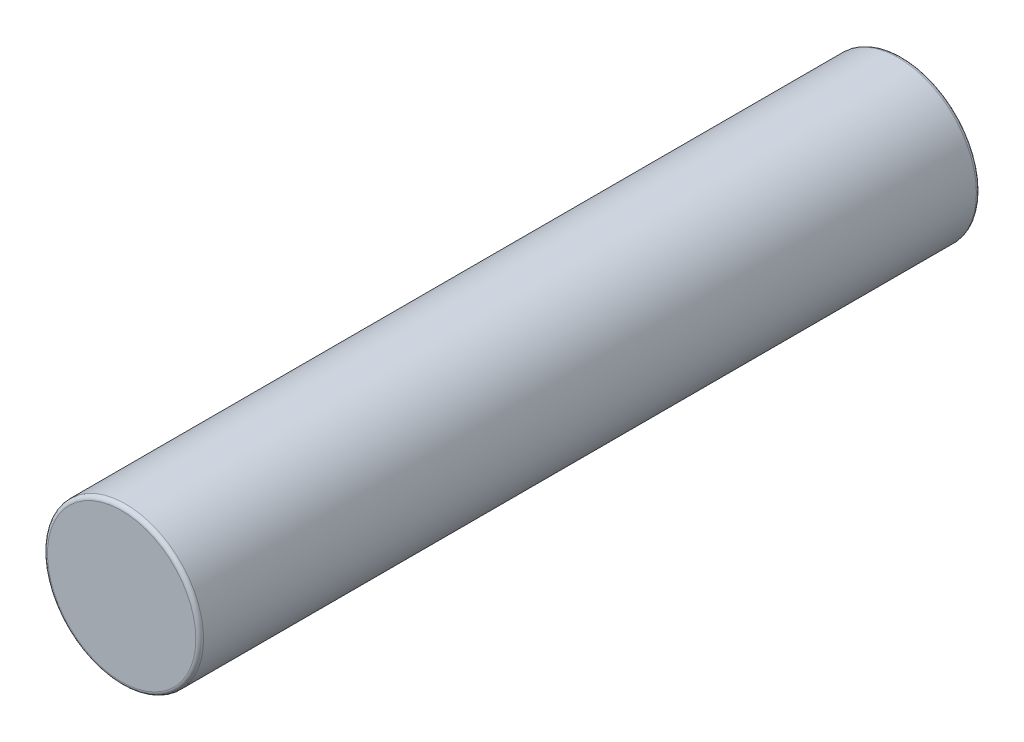
ISO-10303-21;
HEADER;
FILE_DESCRIPTION(('STEP AP214'),'2;1');
FILE_NAME('part.step','',(''),(''),'','','');
FILE_SCHEMA(('AUTOMOTIVE_DESIGN { 1 0 10303 214 1 1 1 1 }'));
ENDSEC;
DATA;
#1=APPLICATION_CONTEXT('core data for automotive mechanical design processes');
#2=APPLICATION_PROTOCOL_DEFINITION('international standard','automotive_design',2000,#1);
#3=PRODUCT_CONTEXT('',#1,'mechanical');
#4=PRODUCT('Part','Part','',(#3));
#5=PRODUCT_RELATED_PRODUCT_CATEGORY('part','',(#4));
#6=PRODUCT_DEFINITION_FORMATION('','',#4);
#7=PRODUCT_DEFINITION_CONTEXT('part definition',#1,'design');
#8=PRODUCT_DEFINITION('design','',#6,#7);
#9=PRODUCT_DEFINITION_SHAPE('','',#8);
#10=(LENGTH_UNIT() NAMED_UNIT(*) SI_UNIT(.MILLI.,.METRE.));
#11=(NAMED_UNIT(*) PLANE_ANGLE_UNIT() SI_UNIT($,.RADIAN.));
#12=(NAMED_UNIT(*) SI_UNIT($,.STERADIAN.) SOLID_ANGLE_UNIT());
#13=UNCERTAINTY_MEASURE_WITH_UNIT(LENGTH_MEASURE(1.E-05),#10,'distance_accuracy_value','');
#14=(GEOMETRIC_REPRESENTATION_CONTEXT(3) GLOBAL_UNCERTAINTY_ASSIGNED_CONTEXT((#13)) GLOBAL_UNIT_ASSIGNED_CONTEXT((#10,
#11,#12)) REPRESENTATION_CONTEXT('',''));
#15=CARTESIAN_POINT('',(0.,0.,0.));
#16=DIRECTION('',(0.,0.,1.));
#17=DIRECTION('',(1.,0.,0.));
#18=AXIS2_PLACEMENT_3D('',#15,#16,#17);
#19=CARTESIAN_POINT('',(0.,0.,200.));
#20=DIRECTION('',(0.,0.,-1.));
#21=DIRECTION('',(-1.,0.,0.));
#22=AXIS2_PLACEMENT_3D('',#19,#20,#21);
#23=CYLINDRICAL_SURFACE('',#22,20.);
#24=CARTESIAN_POINT('',(0.,0.,1.));
#25=DIRECTION('',(0.,0.,1.));
#26=DIRECTION('',(1.,0.,0.));
#27=AXIS2_PLACEMENT_3D('',#24,#25,#26);
#28=CIRCLE('',#27,20.);
#29=CARTESIAN_POINT('',(20.,0.,1.));
#30=VERTEX_POINT('',#29);
#31=EDGE_CURVE('E50',#30,#30,#28,.T.);
#32=ORIENTED_EDGE('',*,*,#31,.T.);
#33=EDGE_LOOP('',(#32));
#34=FACE_BOUND('',#33,.T.);
#35=CARTESIAN_POINT('',(0.,0.,199.));
#36=DIRECTION('',(0.,0.,1.));
#37=DIRECTION('',(1.,0.,0.));
#38=AXIS2_PLACEMENT_3D('',#35,#36,#37);
#39=CIRCLE('',#38,20.);
#40=CARTESIAN_POINT('',(20.,0.,199.));
#41=VERTEX_POINT('',#40);
#42=EDGE_CURVE('E55',#41,#41,#39,.F.);
#43=ORIENTED_EDGE('',*,*,#42,.T.);
#44=EDGE_LOOP('',(#43));
#45=FACE_BOUND('',#44,.T.);
#46=ADVANCED_FACE('F37',(#34,#45),#23,.T.);
#47=CARTESIAN_POINT('',(0.,0.,200.));
#48=DIRECTION('',(0.,0.,1.));
#49=DIRECTION('',(1.,0.,0.));
#50=AXIS2_PLACEMENT_3D('',#47,#48,#49);
#51=PLANE('',#50);
#52=CARTESIAN_POINT('',(0.,0.,200.));
#53=DIRECTION('',(0.,0.,1.));
#54=DIRECTION('',(1.,0.,0.));
#55=AXIS2_PLACEMENT_3D('',#52,#53,#54);
#56=CIRCLE('',#55,19.);
#57=CARTESIAN_POINT('',(19.,0.,200.));
#58=VERTEX_POINT('',#57);
#59=EDGE_CURVE('E10',#58,#58,#56,.T.);
#60=ORIENTED_EDGE('',*,*,#59,.T.);
#61=EDGE_LOOP('',(#60));
#62=FACE_BOUND('',#61,.T.);
#63=ADVANCED_FACE('F72',(#62),#51,.T.);
#64=CARTESIAN_POINT('',(0.,0.,0.));
#65=DIRECTION('',(0.,0.,1.));
#66=DIRECTION('',(1.,0.,0.));
#67=AXIS2_PLACEMENT_3D('',#64,#65,#66);
#68=PLANE('',#67);
#69=CARTESIAN_POINT('',(0.,0.,0.));
#70=DIRECTION('',(0.,0.,1.));
#71=DIRECTION('',(1.,0.,0.));
#72=AXIS2_PLACEMENT_3D('',#69,#70,#71);
#73=CIRCLE('',#72,19.);
#74=CARTESIAN_POINT('',(19.,0.,0.));
#75=VERTEX_POINT('',#74);
#76=EDGE_CURVE('E45',#75,#75,#73,.F.);
#77=ORIENTED_EDGE('',*,*,#76,.T.);
#78=EDGE_LOOP('',(#77));
#79=FACE_BOUND('',#78,.T.);
#80=ADVANCED_FACE('F69',(#79),#68,.F.);
#81=CARTESIAN_POINT('',(0.,0.,1.));
#82=DIRECTION('',(0.,0.,1.));
#83=DIRECTION('',(1.,0.,0.));
#84=AXIS2_PLACEMENT_3D('',#81,#82,#83);
#85=TOROIDAL_SURFACE('',#84,19.,1.);
#86=ORIENTED_EDGE('',*,*,#76,.F.);
#87=EDGE_LOOP('',(#86));
#88=FACE_BOUND('',#87,.T.);
#89=ORIENTED_EDGE('',*,*,#31,.F.);
#90=EDGE_LOOP('',(#89));
#91=FACE_BOUND('',#90,.T.);
#92=ADVANCED_FACE('F65',(#88,#91),#85,.T.);
#93=CARTESIAN_POINT('',(0.,0.,199.));
#94=DIRECTION('',(0.,0.,1.));
#95=DIRECTION('',(1.,0.,0.));
#96=AXIS2_PLACEMENT_3D('',#93,#94,#95);
#97=TOROIDAL_SURFACE('',#96,19.,1.);
#98=ORIENTED_EDGE('',*,*,#42,.F.);
#99=EDGE_LOOP('',(#98));
#100=FACE_BOUND('',#99,.T.);
#101=ORIENTED_EDGE('',*,*,#59,.F.);
#102=EDGE_LOOP('',(#101));
#103=FACE_BOUND('',#102,.T.);
#104=ADVANCED_FACE('F39',(#100,#103),#97,.T.);
#105=CLOSED_SHELL('',(#46,#63,#80,#92,#104));
#106=MANIFOLD_SOLID_BREP('B2',#105);
#107=ADVANCED_BREP_SHAPE_REPRESENTATION('',(#18,#106),#14);
#108=SHAPE_DEFINITION_REPRESENTATION(#9,#107);
ENDSEC;
END-ISO-10303-21;
